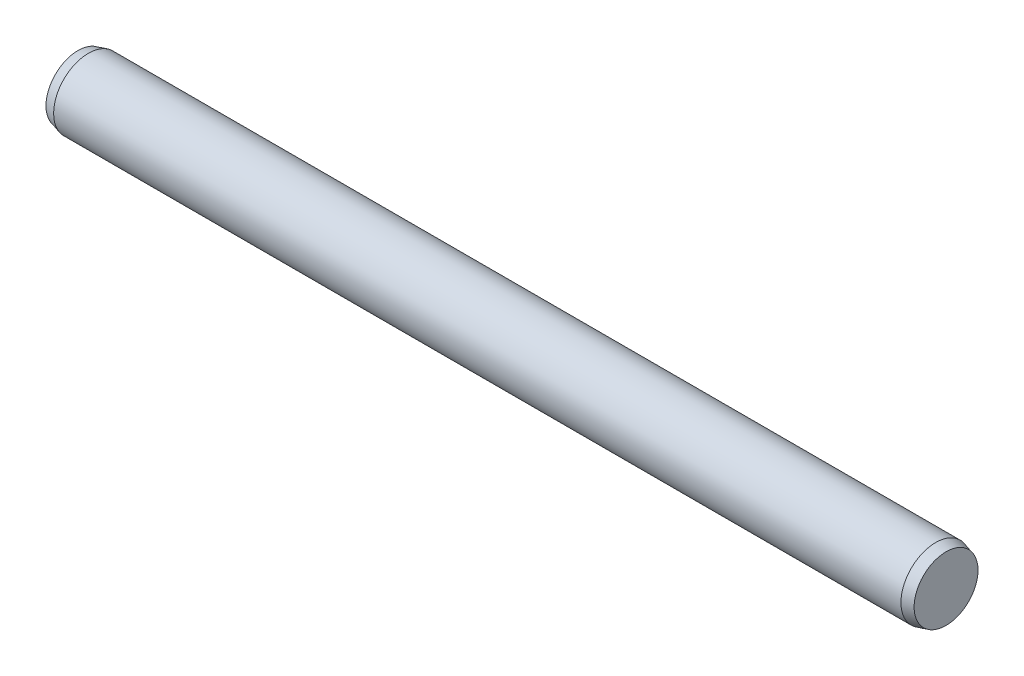
ISO-10303-21;
HEADER;
FILE_DESCRIPTION(('STEP AP214'),'2;1');
FILE_NAME('part.step','',(''),(''),'','','');
FILE_SCHEMA(('AUTOMOTIVE_DESIGN { 1 0 10303 214 1 1 1 1 }'));
ENDSEC;
DATA;
#1=APPLICATION_CONTEXT('core data for automotive mechanical design processes');
#2=APPLICATION_PROTOCOL_DEFINITION('international standard','automotive_design',2000,#1);
#3=PRODUCT_CONTEXT('',#1,'mechanical');
#4=PRODUCT('Part','Part','',(#3));
#5=PRODUCT_RELATED_PRODUCT_CATEGORY('part','',(#4));
#6=PRODUCT_DEFINITION_FORMATION('','',#4);
#7=PRODUCT_DEFINITION_CONTEXT('part definition',#1,'design');
#8=PRODUCT_DEFINITION('design','',#6,#7);
#9=PRODUCT_DEFINITION_SHAPE('','',#8);
#10=(LENGTH_UNIT() NAMED_UNIT(*) SI_UNIT(.MILLI.,.METRE.));
#11=(NAMED_UNIT(*) PLANE_ANGLE_UNIT() SI_UNIT($,.RADIAN.));
#12=(NAMED_UNIT(*) SI_UNIT($,.STERADIAN.) SOLID_ANGLE_UNIT());
#13=UNCERTAINTY_MEASURE_WITH_UNIT(LENGTH_MEASURE(1.E-05),#10,'distance_accuracy_value','');
#14=(GEOMETRIC_REPRESENTATION_CONTEXT(3) GLOBAL_UNCERTAINTY_ASSIGNED_CONTEXT((#13)) GLOBAL_UNIT_ASSIGNED_CONTEXT((#10,
#11,#12)) REPRESENTATION_CONTEXT('',''));
#15=CARTESIAN_POINT('',(0.,0.,0.));
#16=DIRECTION('',(0.,0.,1.));
#17=DIRECTION('',(1.,0.,0.));
#18=AXIS2_PLACEMENT_3D('',#15,#16,#17);
#19=CARTESIAN_POINT('',(-4.87999999999999,0.,0.));
#20=DIRECTION('',(1.,0.,0.));
#21=DIRECTION('',(0.,0.,-1.));
#22=AXIS2_PLACEMENT_3D('',#19,#20,#21);
#23=CYLINDRICAL_SURFACE('',#22,0.400000000000001);
#24=CARTESIAN_POINT('',(-4.87999999999999,0.,0.));
#25=DIRECTION('',(-1.,0.,0.));
#26=DIRECTION('',(0.,0.,1.));
#27=AXIS2_PLACEMENT_3D('',#24,#25,#26);
#28=CIRCLE('',#27,0.400000000000001);
#29=CARTESIAN_POINT('',(-4.87999999999999,0.,0.400000000000001));
#30=VERTEX_POINT('',#29);
#31=EDGE_CURVE('E46',#30,#30,#28,.T.);
#32=ORIENTED_EDGE('',*,*,#31,.F.);
#33=EDGE_LOOP('',(#32));
#34=FACE_BOUND('',#33,.T.);
#35=CARTESIAN_POINT('',(4.88,0.,0.));
#36=DIRECTION('',(1.,0.,0.));
#37=DIRECTION('',(0.,0.,-1.));
#38=AXIS2_PLACEMENT_3D('',#35,#36,#37);
#39=CIRCLE('',#38,0.400000000000001);
#40=CARTESIAN_POINT('',(4.88,0.,-0.400000000000001));
#41=VERTEX_POINT('',#40);
#42=EDGE_CURVE('E10',#41,#41,#39,.T.);
#43=ORIENTED_EDGE('',*,*,#42,.F.);
#44=EDGE_LOOP('',(#43));
#45=FACE_BOUND('',#44,.T.);
#46=ADVANCED_FACE('F32',(#34,#45),#23,.T.);
#47=CARTESIAN_POINT('',(4.88,0.,0.));
#48=DIRECTION('',(-1.,0.,0.));
#49=DIRECTION('',(0.,0.,-1.));
#50=AXIS2_PLACEMENT_3D('',#47,#48,#49);
#51=CONICAL_SURFACE('',#50,0.400000000000001,0.26179938779915);
#52=CARTESIAN_POINT('',(5.,0.,0.));
#53=DIRECTION('',(1.,0.,0.));
#54=DIRECTION('',(0.,0.,-1.));
#55=AXIS2_PLACEMENT_3D('',#52,#53,#54);
#56=CIRCLE('',#55,0.367846096908265);
#57=CARTESIAN_POINT('',(5.,0.,-0.367846096908265));
#58=VERTEX_POINT('',#57);
#59=EDGE_CURVE('E38',#58,#58,#56,.T.);
#60=ORIENTED_EDGE('',*,*,#59,.F.);
#61=EDGE_LOOP('',(#60));
#62=FACE_BOUND('',#61,.T.);
#63=ORIENTED_EDGE('',*,*,#42,.T.);
#64=EDGE_LOOP('',(#63));
#65=FACE_BOUND('',#64,.T.);
#66=ADVANCED_FACE('F56',(#62,#65),#51,.T.);
#67=CARTESIAN_POINT('',(5.,0.,0.));
#68=DIRECTION('',(1.,0.,0.));
#69=DIRECTION('',(0.,0.,-1.));
#70=AXIS2_PLACEMENT_3D('',#67,#68,#69);
#71=PLANE('',#70);
#72=ORIENTED_EDGE('',*,*,#59,.T.);
#73=EDGE_LOOP('',(#72));
#74=FACE_BOUND('',#73,.T.);
#75=ADVANCED_FACE('F60',(#74),#71,.T.);
#76=CARTESIAN_POINT('',(-4.87999999999999,0.,0.));
#77=DIRECTION('',(1.,0.,0.));
#78=DIRECTION('',(0.,0.,1.));
#79=AXIS2_PLACEMENT_3D('',#76,#77,#78);
#80=CONICAL_SURFACE('',#79,0.400000000000001,0.26179938779915);
#81=CARTESIAN_POINT('',(-4.99999999999999,0.,0.));
#82=DIRECTION('',(-1.,0.,0.));
#83=DIRECTION('',(0.,0.,1.));
#84=AXIS2_PLACEMENT_3D('',#81,#82,#83);
#85=CIRCLE('',#84,0.367846096908266);
#86=CARTESIAN_POINT('',(-4.99999999999999,0.,0.367846096908266));
#87=VERTEX_POINT('',#86);
#88=EDGE_CURVE('E42',#87,#87,#85,.T.);
#89=ORIENTED_EDGE('',*,*,#88,.F.);
#90=EDGE_LOOP('',(#89));
#91=FACE_BOUND('',#90,.T.);
#92=ORIENTED_EDGE('',*,*,#31,.T.);
#93=EDGE_LOOP('',(#92));
#94=FACE_BOUND('',#93,.T.);
#95=ADVANCED_FACE('F52',(#91,#94),#80,.T.);
#96=CARTESIAN_POINT('',(-4.99999999999999,0.,0.));
#97=DIRECTION('',(-1.,0.,0.));
#98=DIRECTION('',(0.,0.,1.));
#99=AXIS2_PLACEMENT_3D('',#96,#97,#98);
#100=PLANE('',#99);
#101=ORIENTED_EDGE('',*,*,#88,.T.);
#102=EDGE_LOOP('',(#101));
#103=FACE_BOUND('',#102,.T.);
#104=ADVANCED_FACE('F69',(#103),#100,.T.);
#105=CLOSED_SHELL('',(#46,#66,#75,#95,#104));
#106=MANIFOLD_SOLID_BREP('B2',#105);
#107=ADVANCED_BREP_SHAPE_REPRESENTATION('',(#18,#106),#14);
#108=SHAPE_DEFINITION_REPRESENTATION(#9,#107);
ENDSEC;
END-ISO-10303-21;
